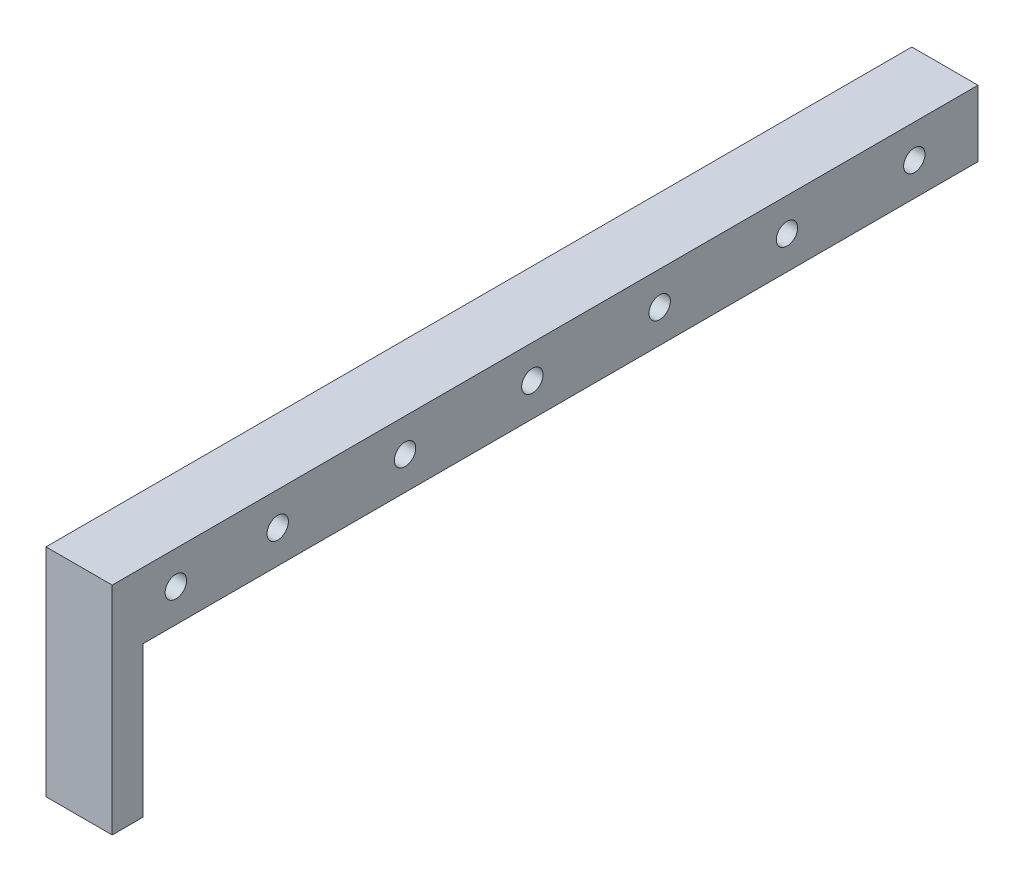
ISO-10303-21;
HEADER;
FILE_DESCRIPTION(('STEP AP214'),'2;1');
FILE_NAME('part.step','',(''),(''),'','','');
FILE_SCHEMA(('AUTOMOTIVE_DESIGN { 1 0 10303 214 1 1 1 1 }'));
ENDSEC;
DATA;
#1=APPLICATION_CONTEXT('core data for automotive mechanical design processes');
#2=APPLICATION_PROTOCOL_DEFINITION('international standard','automotive_design',2000,#1);
#3=PRODUCT_CONTEXT('',#1,'mechanical');
#4=PRODUCT('Part','Part','',(#3));
#5=PRODUCT_RELATED_PRODUCT_CATEGORY('part','',(#4));
#6=PRODUCT_DEFINITION_FORMATION('','',#4);
#7=PRODUCT_DEFINITION_CONTEXT('part definition',#1,'design');
#8=PRODUCT_DEFINITION('design','',#6,#7);
#9=PRODUCT_DEFINITION_SHAPE('','',#8);
#10=(LENGTH_UNIT() NAMED_UNIT(*) SI_UNIT(.MILLI.,.METRE.));
#11=(NAMED_UNIT(*) PLANE_ANGLE_UNIT() SI_UNIT($,.RADIAN.));
#12=(NAMED_UNIT(*) SI_UNIT($,.STERADIAN.) SOLID_ANGLE_UNIT());
#13=UNCERTAINTY_MEASURE_WITH_UNIT(LENGTH_MEASURE(1.E-05),#10,'distance_accuracy_value','');
#14=(GEOMETRIC_REPRESENTATION_CONTEXT(3) GLOBAL_UNCERTAINTY_ASSIGNED_CONTEXT((#13)) GLOBAL_UNIT_ASSIGNED_CONTEXT((#10,
#11,#12)) REPRESENTATION_CONTEXT('',''));
#15=CARTESIAN_POINT('',(0.,0.,0.));
#16=DIRECTION('',(0.,0.,1.));
#17=DIRECTION('',(1.,0.,0.));
#18=AXIS2_PLACEMENT_3D('',#15,#16,#17);
#19=CARTESIAN_POINT('',(-6.5,-6.5,85.));
#20=DIRECTION('',(0.,1.,0.));
#21=DIRECTION('',(0.,0.,1.));
#22=AXIS2_PLACEMENT_3D('',#19,#20,#21);
#23=PLANE('',#22);
#24=DIRECTION('',(1.,0.,0.));
#25=VECTOR('',#24,1.);
#26=CARTESIAN_POINT('',(-6.5,-6.5,79.));
#27=LINE('',#26,#25);
#28=CARTESIAN_POINT('',(-6.5,-6.5,79.));
#29=VERTEX_POINT('',#28);
#30=CARTESIAN_POINT('',(6.5,-6.50000000000001,79.));
#31=VERTEX_POINT('',#30);
#32=EDGE_CURVE('E53',#29,#31,#27,.T.);
#33=ORIENTED_EDGE('',*,*,#32,.F.);
#34=DIRECTION('',(0.,0.,-1.));
#35=VECTOR('',#34,1.);
#36=CARTESIAN_POINT('',(-6.5,-6.5,85.));
#37=LINE('',#36,#35);
#38=CARTESIAN_POINT('',(-6.5,-6.5,-85.));
#39=VERTEX_POINT('',#38);
#40=EDGE_CURVE('E11',#29,#39,#37,.T.);
#41=ORIENTED_EDGE('',*,*,#40,.T.);
#42=DIRECTION('',(1.,0.,0.));
#43=VECTOR('',#42,1.);
#44=CARTESIAN_POINT('',(-6.5,-6.5,-85.));
#45=LINE('',#44,#43);
#46=CARTESIAN_POINT('',(6.5,-6.5,-85.));
#47=VERTEX_POINT('',#46);
#48=EDGE_CURVE('E101',#39,#47,#45,.T.);
#49=ORIENTED_EDGE('',*,*,#48,.T.);
#50=DIRECTION('',(0.,0.,-1.));
#51=VECTOR('',#50,1.);
#52=CARTESIAN_POINT('',(6.5,-6.5,85.));
#53=LINE('',#52,#51);
#54=EDGE_CURVE('E46',#31,#47,#53,.T.);
#55=ORIENTED_EDGE('',*,*,#54,.F.);
#56=EDGE_LOOP('',(#33,#41,#49,#55));
#57=FACE_BOUND('',#56,.T.);
#58=ADVANCED_FACE('F37',(#57),#23,.F.);
#59=CARTESIAN_POINT('',(-6.5,6.5,85.));
#60=DIRECTION('',(1.,0.,0.));
#61=DIRECTION('',(0.,0.,-1.));
#62=AXIS2_PLACEMENT_3D('',#59,#60,#61);
#63=PLANE('',#62);
#64=CARTESIAN_POINT('',(-6.5,0.,-72.5));
#65=DIRECTION('',(1.,0.,0.));
#66=DIRECTION('',(0.,0.,-1.));
#67=AXIS2_PLACEMENT_3D('',#64,#65,#66);
#68=CIRCLE('',#67,5.25);
#69=CARTESIAN_POINT('',(-6.5,0.,-77.75));
#70=VERTEX_POINT('',#69);
#71=EDGE_CURVE('E41',#70,#70,#68,.T.);
#72=ORIENTED_EDGE('',*,*,#71,.T.);
#73=EDGE_LOOP('',(#72));
#74=FACE_BOUND('',#73,.T.);
#75=CARTESIAN_POINT('',(-6.5,0.,-47.5));
#76=DIRECTION('',(1.,0.,0.));
#77=DIRECTION('',(0.,0.,-1.));
#78=AXIS2_PLACEMENT_3D('',#75,#76,#77);
#79=CIRCLE('',#78,5.25);
#80=CARTESIAN_POINT('',(-6.5,0.,-52.75));
#81=VERTEX_POINT('',#80);
#82=EDGE_CURVE('E170',#81,#81,#79,.T.);
#83=ORIENTED_EDGE('',*,*,#82,.T.);
#84=EDGE_LOOP('',(#83));
#85=FACE_BOUND('',#84,.T.);
#86=CARTESIAN_POINT('',(-6.5,0.,-22.5));
#87=DIRECTION('',(1.,0.,0.));
#88=DIRECTION('',(0.,0.,-1.));
#89=AXIS2_PLACEMENT_3D('',#86,#87,#88);
#90=CIRCLE('',#89,5.25);
#91=CARTESIAN_POINT('',(-6.5,0.,-27.75));
#92=VERTEX_POINT('',#91);
#93=EDGE_CURVE('E168',#92,#92,#90,.T.);
#94=ORIENTED_EDGE('',*,*,#93,.T.);
#95=EDGE_LOOP('',(#94));
#96=FACE_BOUND('',#95,.T.);
#97=CARTESIAN_POINT('',(-6.5,0.,2.5));
#98=DIRECTION('',(1.,0.,0.));
#99=DIRECTION('',(0.,0.,-1.));
#100=AXIS2_PLACEMENT_3D('',#97,#98,#99);
#101=CIRCLE('',#100,5.25);
#102=CARTESIAN_POINT('',(-6.5,0.,-2.75));
#103=VERTEX_POINT('',#102);
#104=EDGE_CURVE('E165',#103,#103,#101,.T.);
#105=ORIENTED_EDGE('',*,*,#104,.T.);
#106=EDGE_LOOP('',(#105));
#107=FACE_BOUND('',#106,.T.);
#108=CARTESIAN_POINT('',(-6.5,0.,27.5));
#109=DIRECTION('',(1.,0.,0.));
#110=DIRECTION('',(0.,0.,-1.));
#111=AXIS2_PLACEMENT_3D('',#108,#109,#110);
#112=CIRCLE('',#111,5.25);
#113=CARTESIAN_POINT('',(-6.5,0.,22.25));
#114=VERTEX_POINT('',#113);
#115=EDGE_CURVE('E162',#114,#114,#112,.T.);
#116=ORIENTED_EDGE('',*,*,#115,.T.);
#117=EDGE_LOOP('',(#116));
#118=FACE_BOUND('',#117,.T.);
#119=CARTESIAN_POINT('',(-6.5,0.,52.5));
#120=DIRECTION('',(1.,0.,0.));
#121=DIRECTION('',(0.,0.,-1.));
#122=AXIS2_PLACEMENT_3D('',#119,#120,#121);
#123=CIRCLE('',#122,5.25);
#124=CARTESIAN_POINT('',(-6.5,0.,47.25));
#125=VERTEX_POINT('',#124);
#126=EDGE_CURVE('E159',#125,#125,#123,.T.);
#127=ORIENTED_EDGE('',*,*,#126,.T.);
#128=EDGE_LOOP('',(#127));
#129=FACE_BOUND('',#128,.T.);
#130=CARTESIAN_POINT('',(-6.5,0.,72.5));
#131=DIRECTION('',(1.,0.,0.));
#132=DIRECTION('',(0.,0.,-1.));
#133=AXIS2_PLACEMENT_3D('',#130,#131,#132);
#134=CIRCLE('',#133,5.25);
#135=CARTESIAN_POINT('',(-6.5,0.,67.25));
#136=VERTEX_POINT('',#135);
#137=EDGE_CURVE('E156',#136,#136,#134,.T.);
#138=ORIENTED_EDGE('',*,*,#137,.T.);
#139=EDGE_LOOP('',(#138));
#140=FACE_BOUND('',#139,.T.);
#141=DIRECTION('',(0.,0.,-1.));
#142=VECTOR('',#141,1.);
#143=CARTESIAN_POINT('',(-6.5,-36.,85.));
#144=LINE('',#143,#142);
#145=CARTESIAN_POINT('',(-6.5,-36.,85.));
#146=VERTEX_POINT('',#145);
#147=CARTESIAN_POINT('',(-6.5,-36.,79.));
#148=VERTEX_POINT('',#147);
#149=EDGE_CURVE('E104',#146,#148,#144,.T.);
#150=ORIENTED_EDGE('',*,*,#149,.F.);
#151=DIRECTION('',(0.,-1.,0.));
#152=VECTOR('',#151,1.);
#153=CARTESIAN_POINT('',(-6.5,6.5,85.));
#154=LINE('',#153,#152);
#155=CARTESIAN_POINT('',(-6.5,6.5,85.));
#156=VERTEX_POINT('',#155);
#157=EDGE_CURVE('E90',#156,#146,#154,.T.);
#158=ORIENTED_EDGE('',*,*,#157,.F.);
#159=DIRECTION('',(0.,0.,-1.));
#160=VECTOR('',#159,1.);
#161=CARTESIAN_POINT('',(-6.5,6.5,85.));
#162=LINE('',#161,#160);
#163=CARTESIAN_POINT('',(-6.5,6.5,-85.));
#164=VERTEX_POINT('',#163);
#165=EDGE_CURVE('E83',#156,#164,#162,.T.);
#166=ORIENTED_EDGE('',*,*,#165,.T.);
#167=DIRECTION('',(0.,-1.,0.));
#168=VECTOR('',#167,1.);
#169=CARTESIAN_POINT('',(-6.5,6.5,-85.));
#170=LINE('',#169,#168);
#171=EDGE_CURVE('E96',#164,#39,#170,.T.);
#172=ORIENTED_EDGE('',*,*,#171,.T.);
#173=ORIENTED_EDGE('',*,*,#40,.F.);
#174=DIRECTION('',(0.,-1.,0.));
#175=VECTOR('',#174,1.);
#176=CARTESIAN_POINT('',(-6.5,-5.5,79.));
#177=LINE('',#176,#175);
#178=EDGE_CURVE('E133',#29,#148,#177,.T.);
#179=ORIENTED_EDGE('',*,*,#178,.T.);
#180=EDGE_LOOP('',(#150,#158,#166,#172,#173,#179));
#181=FACE_BOUND('',#180,.T.);
#182=ADVANCED_FACE('F39',(#74,#85,#96,#107,#118,#129,#140,#181),#63,.F.);
#183=CARTESIAN_POINT('',(6.5,-6.5,85.));
#184=DIRECTION('',(-1.,0.,0.));
#185=DIRECTION('',(0.,0.,1.));
#186=AXIS2_PLACEMENT_3D('',#183,#184,#185);
#187=PLANE('',#186);
#188=CARTESIAN_POINT('',(6.5,0.,-72.5));
#189=DIRECTION('',(-1.,0.,0.));
#190=DIRECTION('',(0.,0.,1.));
#191=AXIS2_PLACEMENT_3D('',#188,#189,#190);
#192=CIRCLE('',#191,2.1);
#193=CARTESIAN_POINT('',(6.5,0.,-70.4));
#194=VERTEX_POINT('',#193);
#195=EDGE_CURVE('E130',#194,#194,#192,.T.);
#196=ORIENTED_EDGE('',*,*,#195,.T.);
#197=EDGE_LOOP('',(#196));
#198=FACE_BOUND('',#197,.T.);
#199=CARTESIAN_POINT('',(6.5,0.,-47.5));
#200=DIRECTION('',(-1.,0.,0.));
#201=DIRECTION('',(0.,0.,1.));
#202=AXIS2_PLACEMENT_3D('',#199,#200,#201);
#203=CIRCLE('',#202,2.1);
#204=CARTESIAN_POINT('',(6.5,0.,-45.4));
#205=VERTEX_POINT('',#204);
#206=EDGE_CURVE('E127',#205,#205,#203,.T.);
#207=ORIENTED_EDGE('',*,*,#206,.T.);
#208=EDGE_LOOP('',(#207));
#209=FACE_BOUND('',#208,.T.);
#210=CARTESIAN_POINT('',(6.5,0.,-22.5));
#211=DIRECTION('',(-1.,0.,0.));
#212=DIRECTION('',(0.,0.,1.));
#213=AXIS2_PLACEMENT_3D('',#210,#211,#212);
#214=CIRCLE('',#213,2.1);
#215=CARTESIAN_POINT('',(6.5,0.,-20.4));
#216=VERTEX_POINT('',#215);
#217=EDGE_CURVE('E124',#216,#216,#214,.T.);
#218=ORIENTED_EDGE('',*,*,#217,.T.);
#219=EDGE_LOOP('',(#218));
#220=FACE_BOUND('',#219,.T.);
#221=CARTESIAN_POINT('',(6.5,0.,2.5));
#222=DIRECTION('',(-1.,0.,0.));
#223=DIRECTION('',(0.,0.,1.));
#224=AXIS2_PLACEMENT_3D('',#221,#222,#223);
#225=CIRCLE('',#224,2.1);
#226=CARTESIAN_POINT('',(6.5,0.,4.6));
#227=VERTEX_POINT('',#226);
#228=EDGE_CURVE('E121',#227,#227,#225,.T.);
#229=ORIENTED_EDGE('',*,*,#228,.T.);
#230=EDGE_LOOP('',(#229));
#231=FACE_BOUND('',#230,.T.);
#232=CARTESIAN_POINT('',(6.5,0.,27.5));
#233=DIRECTION('',(-1.,0.,0.));
#234=DIRECTION('',(0.,0.,1.));
#235=AXIS2_PLACEMENT_3D('',#232,#233,#234);
#236=CIRCLE('',#235,2.1);
#237=CARTESIAN_POINT('',(6.5,0.,29.6));
#238=VERTEX_POINT('',#237);
#239=EDGE_CURVE('E118',#238,#238,#236,.T.);
#240=ORIENTED_EDGE('',*,*,#239,.T.);
#241=EDGE_LOOP('',(#240));
#242=FACE_BOUND('',#241,.T.);
#243=CARTESIAN_POINT('',(6.5,0.,52.5));
#244=DIRECTION('',(-1.,0.,0.));
#245=DIRECTION('',(0.,0.,1.));
#246=AXIS2_PLACEMENT_3D('',#243,#244,#245);
#247=CIRCLE('',#246,2.1);
#248=CARTESIAN_POINT('',(6.5,0.,54.6));
#249=VERTEX_POINT('',#248);
#250=EDGE_CURVE('E115',#249,#249,#247,.T.);
#251=ORIENTED_EDGE('',*,*,#250,.T.);
#252=EDGE_LOOP('',(#251));
#253=FACE_BOUND('',#252,.T.);
#254=CARTESIAN_POINT('',(6.5,0.,72.5));
#255=DIRECTION('',(-1.,0.,0.));
#256=DIRECTION('',(0.,0.,1.));
#257=AXIS2_PLACEMENT_3D('',#254,#255,#256);
#258=CIRCLE('',#257,2.1);
#259=CARTESIAN_POINT('',(6.5,0.,74.6));
#260=VERTEX_POINT('',#259);
#261=EDGE_CURVE('E112',#260,#260,#258,.T.);
#262=ORIENTED_EDGE('',*,*,#261,.T.);
#263=EDGE_LOOP('',(#262));
#264=FACE_BOUND('',#263,.T.);
#265=DIRECTION('',(0.,0.,-1.));
#266=VECTOR('',#265,1.);
#267=CARTESIAN_POINT('',(6.5,6.5,85.));
#268=LINE('',#267,#266);
#269=CARTESIAN_POINT('',(6.5,6.5,85.));
#270=VERTEX_POINT('',#269);
#271=CARTESIAN_POINT('',(6.5,6.5,-85.));
#272=VERTEX_POINT('',#271);
#273=EDGE_CURVE('E86',#270,#272,#268,.T.);
#274=ORIENTED_EDGE('',*,*,#273,.F.);
#275=DIRECTION('',(0.,1.,0.));
#276=VECTOR('',#275,1.);
#277=CARTESIAN_POINT('',(6.5,-6.5,85.));
#278=LINE('',#277,#276);
#279=CARTESIAN_POINT('',(6.5,-36.,85.));
#280=VERTEX_POINT('',#279);
#281=EDGE_CURVE('E328',#280,#270,#278,.T.);
#282=ORIENTED_EDGE('',*,*,#281,.F.);
#283=DIRECTION('',(0.,0.,-1.));
#284=VECTOR('',#283,1.);
#285=CARTESIAN_POINT('',(6.5,-36.,85.));
#286=LINE('',#285,#284);
#287=CARTESIAN_POINT('',(6.5,-36.,79.));
#288=VERTEX_POINT('',#287);
#289=EDGE_CURVE('E315',#280,#288,#286,.T.);
#290=ORIENTED_EDGE('',*,*,#289,.T.);
#291=DIRECTION('',(0.,1.,0.));
#292=VECTOR('',#291,1.);
#293=CARTESIAN_POINT('',(6.5,-36.,79.));
#294=LINE('',#293,#292);
#295=EDGE_CURVE('E316',#288,#31,#294,.T.);
#296=ORIENTED_EDGE('',*,*,#295,.T.);
#297=ORIENTED_EDGE('',*,*,#54,.T.);
#298=DIRECTION('',(0.,1.,0.));
#299=VECTOR('',#298,1.);
#300=CARTESIAN_POINT('',(6.5,-6.5,-85.));
#301=LINE('',#300,#299);
#302=EDGE_CURVE('E91',#47,#272,#301,.T.);
#303=ORIENTED_EDGE('',*,*,#302,.T.);
#304=EDGE_LOOP('',(#274,#282,#290,#296,#297,#303));
#305=FACE_BOUND('',#304,.T.);
#306=ADVANCED_FACE('F200',(#198,#209,#220,#231,#242,#253,#264,#305),#187,.F.);
#307=CARTESIAN_POINT('',(6.5,6.5,85.));
#308=DIRECTION('',(0.,-1.,0.));
#309=DIRECTION('',(0.,0.,-1.));
#310=AXIS2_PLACEMENT_3D('',#307,#308,#309);
#311=PLANE('',#310);
#312=DIRECTION('',(-1.,0.,0.));
#313=VECTOR('',#312,1.);
#314=CARTESIAN_POINT('',(6.5,6.5,-85.));
#315=LINE('',#314,#313);
#316=EDGE_CURVE('E80',#272,#164,#315,.T.);
#317=ORIENTED_EDGE('',*,*,#316,.T.);
#318=ORIENTED_EDGE('',*,*,#165,.F.);
#319=DIRECTION('',(-1.,0.,0.));
#320=VECTOR('',#319,1.);
#321=CARTESIAN_POINT('',(6.5,6.5,85.));
#322=LINE('',#321,#320);
#323=EDGE_CURVE('E62',#270,#156,#322,.T.);
#324=ORIENTED_EDGE('',*,*,#323,.F.);
#325=ORIENTED_EDGE('',*,*,#273,.T.);
#326=EDGE_LOOP('',(#317,#318,#324,#325));
#327=FACE_BOUND('',#326,.T.);
#328=ADVANCED_FACE('F82',(#327),#311,.F.);
#329=CARTESIAN_POINT('',(0.,0.,85.));
#330=DIRECTION('',(0.,0.,1.));
#331=DIRECTION('',(1.,0.,0.));
#332=AXIS2_PLACEMENT_3D('',#329,#330,#331);
#333=PLANE('',#332);
#334=ORIENTED_EDGE('',*,*,#281,.T.);
#335=ORIENTED_EDGE('',*,*,#323,.T.);
#336=ORIENTED_EDGE('',*,*,#157,.T.);
#337=DIRECTION('',(1.,0.,0.));
#338=VECTOR('',#337,1.);
#339=CARTESIAN_POINT('',(-6.5,-36.,85.));
#340=LINE('',#339,#338);
#341=EDGE_CURVE('E312',#146,#280,#340,.T.);
#342=ORIENTED_EDGE('',*,*,#341,.T.);
#343=EDGE_LOOP('',(#334,#335,#336,#342));
#344=FACE_BOUND('',#343,.T.);
#345=ADVANCED_FACE('F207',(#344),#333,.T.);
#346=CARTESIAN_POINT('',(0.,0.,-85.));
#347=DIRECTION('',(0.,0.,1.));
#348=DIRECTION('',(1.,0.,0.));
#349=AXIS2_PLACEMENT_3D('',#346,#347,#348);
#350=PLANE('',#349);
#351=ORIENTED_EDGE('',*,*,#171,.F.);
#352=ORIENTED_EDGE('',*,*,#316,.F.);
#353=ORIENTED_EDGE('',*,*,#302,.F.);
#354=ORIENTED_EDGE('',*,*,#48,.F.);
#355=EDGE_LOOP('',(#351,#352,#353,#354));
#356=FACE_BOUND('',#355,.T.);
#357=ADVANCED_FACE('F99',(#356),#350,.F.);
#358=CARTESIAN_POINT('',(0.,0.,79.));
#359=DIRECTION('',(0.,0.,1.));
#360=DIRECTION('',(1.,0.,0.));
#361=AXIS2_PLACEMENT_3D('',#358,#359,#360);
#362=PLANE('',#361);
#363=ORIENTED_EDGE('',*,*,#178,.F.);
#364=ORIENTED_EDGE('',*,*,#32,.T.);
#365=ORIENTED_EDGE('',*,*,#295,.F.);
#366=DIRECTION('',(1.,0.,0.));
#367=VECTOR('',#366,1.);
#368=CARTESIAN_POINT('',(-6.5,-36.,79.));
#369=LINE('',#368,#367);
#370=EDGE_CURVE('E319',#148,#288,#369,.T.);
#371=ORIENTED_EDGE('',*,*,#370,.F.);
#372=EDGE_LOOP('',(#363,#364,#365,#371));
#373=FACE_BOUND('',#372,.T.);
#374=ADVANCED_FACE('F210',(#373),#362,.F.);
#375=CARTESIAN_POINT('',(-6.5,-36.,85.));
#376=DIRECTION('',(0.,1.,0.));
#377=DIRECTION('',(0.,0.,1.));
#378=AXIS2_PLACEMENT_3D('',#375,#376,#377);
#379=PLANE('',#378);
#380=ORIENTED_EDGE('',*,*,#370,.T.);
#381=ORIENTED_EDGE('',*,*,#289,.F.);
#382=ORIENTED_EDGE('',*,*,#341,.F.);
#383=ORIENTED_EDGE('',*,*,#149,.T.);
#384=EDGE_LOOP('',(#380,#381,#382,#383));
#385=FACE_BOUND('',#384,.T.);
#386=ADVANCED_FACE('F213',(#385),#379,.F.);
#387=CARTESIAN_POINT('',(-11.5,0.,72.5));
#388=DIRECTION('',(1.,0.,0.));
#389=DIRECTION('',(0.,0.,-1.));
#390=AXIS2_PLACEMENT_3D('',#387,#388,#389);
#391=CYLINDRICAL_SURFACE('',#390,2.1);
#392=CARTESIAN_POINT('',(-2.,0.,72.5));
#393=DIRECTION('',(1.,0.,0.));
#394=DIRECTION('',(0.,0.,-1.));
#395=AXIS2_PLACEMENT_3D('',#392,#393,#394);
#396=CIRCLE('',#395,2.1);
#397=CARTESIAN_POINT('',(-2.,0.,70.4));
#398=VERTEX_POINT('',#397);
#399=EDGE_CURVE('E153',#398,#398,#396,.F.);
#400=ORIENTED_EDGE('',*,*,#399,.T.);
#401=EDGE_LOOP('',(#400));
#402=FACE_BOUND('',#401,.T.);
#403=ORIENTED_EDGE('',*,*,#261,.F.);
#404=EDGE_LOOP('',(#403));
#405=FACE_BOUND('',#404,.T.);
#406=ADVANCED_FACE('F216',(#402,#405),#391,.F.);
#407=CARTESIAN_POINT('',(-11.5,0.,52.5));
#408=DIRECTION('',(1.,0.,0.));
#409=DIRECTION('',(0.,0.,-1.));
#410=AXIS2_PLACEMENT_3D('',#407,#408,#409);
#411=CYLINDRICAL_SURFACE('',#410,2.1);
#412=CARTESIAN_POINT('',(-2.,0.,52.5));
#413=DIRECTION('',(1.,0.,0.));
#414=DIRECTION('',(0.,0.,-1.));
#415=AXIS2_PLACEMENT_3D('',#412,#413,#414);
#416=CIRCLE('',#415,2.1);
#417=CARTESIAN_POINT('',(-2.,0.,50.4));
#418=VERTEX_POINT('',#417);
#419=EDGE_CURVE('E150',#418,#418,#416,.F.);
#420=ORIENTED_EDGE('',*,*,#419,.T.);
#421=EDGE_LOOP('',(#420));
#422=FACE_BOUND('',#421,.T.);
#423=ORIENTED_EDGE('',*,*,#250,.F.);
#424=EDGE_LOOP('',(#423));
#425=FACE_BOUND('',#424,.T.);
#426=ADVANCED_FACE('F223',(#422,#425),#411,.F.);
#427=CARTESIAN_POINT('',(-11.5,0.,27.5));
#428=DIRECTION('',(1.,0.,0.));
#429=DIRECTION('',(0.,0.,-1.));
#430=AXIS2_PLACEMENT_3D('',#427,#428,#429);
#431=CYLINDRICAL_SURFACE('',#430,2.1);
#432=CARTESIAN_POINT('',(-2.,0.,27.5));
#433=DIRECTION('',(1.,0.,0.));
#434=DIRECTION('',(0.,0.,-1.));
#435=AXIS2_PLACEMENT_3D('',#432,#433,#434);
#436=CIRCLE('',#435,2.1);
#437=CARTESIAN_POINT('',(-2.,0.,25.4));
#438=VERTEX_POINT('',#437);
#439=EDGE_CURVE('E147',#438,#438,#436,.F.);
#440=ORIENTED_EDGE('',*,*,#439,.T.);
#441=EDGE_LOOP('',(#440));
#442=FACE_BOUND('',#441,.T.);
#443=ORIENTED_EDGE('',*,*,#239,.F.);
#444=EDGE_LOOP('',(#443));
#445=FACE_BOUND('',#444,.T.);
#446=ADVANCED_FACE('F227',(#442,#445),#431,.F.);
#447=CARTESIAN_POINT('',(-11.5,0.,2.5));
#448=DIRECTION('',(1.,0.,0.));
#449=DIRECTION('',(0.,0.,-1.));
#450=AXIS2_PLACEMENT_3D('',#447,#448,#449);
#451=CYLINDRICAL_SURFACE('',#450,2.1);
#452=CARTESIAN_POINT('',(-2.,0.,2.5));
#453=DIRECTION('',(1.,0.,0.));
#454=DIRECTION('',(0.,0.,-1.));
#455=AXIS2_PLACEMENT_3D('',#452,#453,#454);
#456=CIRCLE('',#455,2.1);
#457=CARTESIAN_POINT('',(-2.,0.,0.4));
#458=VERTEX_POINT('',#457);
#459=EDGE_CURVE('E144',#458,#458,#456,.F.);
#460=ORIENTED_EDGE('',*,*,#459,.T.);
#461=EDGE_LOOP('',(#460));
#462=FACE_BOUND('',#461,.T.);
#463=ORIENTED_EDGE('',*,*,#228,.F.);
#464=EDGE_LOOP('',(#463));
#465=FACE_BOUND('',#464,.T.);
#466=ADVANCED_FACE('F231',(#462,#465),#451,.F.);
#467=CARTESIAN_POINT('',(-11.5,0.,-22.5));
#468=DIRECTION('',(1.,0.,0.));
#469=DIRECTION('',(0.,0.,-1.));
#470=AXIS2_PLACEMENT_3D('',#467,#468,#469);
#471=CYLINDRICAL_SURFACE('',#470,2.1);
#472=CARTESIAN_POINT('',(-2.,0.,-22.5));
#473=DIRECTION('',(1.,0.,0.));
#474=DIRECTION('',(0.,0.,-1.));
#475=AXIS2_PLACEMENT_3D('',#472,#473,#474);
#476=CIRCLE('',#475,2.1);
#477=CARTESIAN_POINT('',(-2.,0.,-24.6));
#478=VERTEX_POINT('',#477);
#479=EDGE_CURVE('E141',#478,#478,#476,.F.);
#480=ORIENTED_EDGE('',*,*,#479,.T.);
#481=EDGE_LOOP('',(#480));
#482=FACE_BOUND('',#481,.T.);
#483=ORIENTED_EDGE('',*,*,#217,.F.);
#484=EDGE_LOOP('',(#483));
#485=FACE_BOUND('',#484,.T.);
#486=ADVANCED_FACE('F235',(#482,#485),#471,.F.);
#487=CARTESIAN_POINT('',(-11.5,0.,-47.5));
#488=DIRECTION('',(1.,0.,0.));
#489=DIRECTION('',(0.,0.,-1.));
#490=AXIS2_PLACEMENT_3D('',#487,#488,#489);
#491=CYLINDRICAL_SURFACE('',#490,2.1);
#492=CARTESIAN_POINT('',(-2.,0.,-47.5));
#493=DIRECTION('',(1.,0.,0.));
#494=DIRECTION('',(0.,0.,-1.));
#495=AXIS2_PLACEMENT_3D('',#492,#493,#494);
#496=CIRCLE('',#495,2.1);
#497=CARTESIAN_POINT('',(-2.,0.,-49.6));
#498=VERTEX_POINT('',#497);
#499=EDGE_CURVE('E137',#498,#498,#496,.F.);
#500=ORIENTED_EDGE('',*,*,#499,.T.);
#501=EDGE_LOOP('',(#500));
#502=FACE_BOUND('',#501,.T.);
#503=ORIENTED_EDGE('',*,*,#206,.F.);
#504=EDGE_LOOP('',(#503));
#505=FACE_BOUND('',#504,.T.);
#506=ADVANCED_FACE('F191',(#502,#505),#491,.F.);
#507=CARTESIAN_POINT('',(-11.5,0.,-72.5));
#508=DIRECTION('',(1.,0.,0.));
#509=DIRECTION('',(0.,0.,-1.));
#510=AXIS2_PLACEMENT_3D('',#507,#508,#509);
#511=CYLINDRICAL_SURFACE('',#510,2.1);
#512=CARTESIAN_POINT('',(-2.,0.,-72.5));
#513=DIRECTION('',(1.,0.,0.));
#514=DIRECTION('',(0.,0.,-1.));
#515=AXIS2_PLACEMENT_3D('',#512,#513,#514);
#516=CIRCLE('',#515,2.1);
#517=CARTESIAN_POINT('',(-2.,0.,-74.6));
#518=VERTEX_POINT('',#517);
#519=EDGE_CURVE('E134',#518,#518,#516,.F.);
#520=ORIENTED_EDGE('',*,*,#519,.T.);
#521=EDGE_LOOP('',(#520));
#522=FACE_BOUND('',#521,.T.);
#523=ORIENTED_EDGE('',*,*,#195,.F.);
#524=EDGE_LOOP('',(#523));
#525=FACE_BOUND('',#524,.T.);
#526=ADVANCED_FACE('F181',(#522,#525),#511,.F.);
#527=CARTESIAN_POINT('',(-11.,0.,-72.5));
#528=DIRECTION('',(1.,0.,0.));
#529=DIRECTION('',(0.,0.,-1.));
#530=AXIS2_PLACEMENT_3D('',#527,#528,#529);
#531=CYLINDRICAL_SURFACE('',#530,5.25);
#532=CARTESIAN_POINT('',(-2.,0.,-72.5));
#533=DIRECTION('',(1.,0.,0.));
#534=DIRECTION('',(0.,0.,-1.));
#535=AXIS2_PLACEMENT_3D('',#532,#533,#534);
#536=CIRCLE('',#535,5.25);
#537=CARTESIAN_POINT('',(-2.,0.,-77.75));
#538=VERTEX_POINT('',#537);
#539=EDGE_CURVE('E138',#538,#538,#536,.T.);
#540=ORIENTED_EDGE('',*,*,#539,.T.);
#541=EDGE_LOOP('',(#540));
#542=FACE_BOUND('',#541,.T.);
#543=ORIENTED_EDGE('',*,*,#71,.F.);
#544=EDGE_LOOP('',(#543));
#545=FACE_BOUND('',#544,.T.);
#546=ADVANCED_FACE('F178',(#542,#545),#531,.F.);
#547=CARTESIAN_POINT('',(-2.,0.,-72.5));
#548=DIRECTION('',(1.,0.,0.));
#549=DIRECTION('',(0.,0.,-1.));
#550=AXIS2_PLACEMENT_3D('',#547,#548,#549);
#551=PLANE('',#550);
#552=ORIENTED_EDGE('',*,*,#539,.F.);
#553=EDGE_LOOP('',(#552));
#554=FACE_BOUND('',#553,.T.);
#555=ORIENTED_EDGE('',*,*,#519,.F.);
#556=EDGE_LOOP('',(#555));
#557=FACE_BOUND('',#556,.T.);
#558=ADVANCED_FACE('F180',(#554,#557),#551,.F.);
#559=CARTESIAN_POINT('',(-11.,0.,-47.5));
#560=DIRECTION('',(1.,0.,0.));
#561=DIRECTION('',(0.,0.,-1.));
#562=AXIS2_PLACEMENT_3D('',#559,#560,#561);
#563=CYLINDRICAL_SURFACE('',#562,5.25);
#564=CARTESIAN_POINT('',(-2.,0.,-47.5));
#565=DIRECTION('',(1.,0.,0.));
#566=DIRECTION('',(0.,0.,-1.));
#567=AXIS2_PLACEMENT_3D('',#564,#565,#566);
#568=CIRCLE('',#567,5.25);
#569=CARTESIAN_POINT('',(-2.,0.,-52.75));
#570=VERTEX_POINT('',#569);
#571=EDGE_CURVE('E293',#570,#570,#568,.T.);
#572=ORIENTED_EDGE('',*,*,#571,.T.);
#573=EDGE_LOOP('',(#572));
#574=FACE_BOUND('',#573,.T.);
#575=ORIENTED_EDGE('',*,*,#82,.F.);
#576=EDGE_LOOP('',(#575));
#577=FACE_BOUND('',#576,.T.);
#578=ADVANCED_FACE('F188',(#574,#577),#563,.F.);
#579=CARTESIAN_POINT('',(-2.,0.,-47.5));
#580=DIRECTION('',(1.,0.,0.));
#581=DIRECTION('',(0.,0.,-1.));
#582=AXIS2_PLACEMENT_3D('',#579,#580,#581);
#583=PLANE('',#582);
#584=ORIENTED_EDGE('',*,*,#571,.F.);
#585=EDGE_LOOP('',(#584));
#586=FACE_BOUND('',#585,.T.);
#587=ORIENTED_EDGE('',*,*,#499,.F.);
#588=EDGE_LOOP('',(#587));
#589=FACE_BOUND('',#588,.T.);
#590=ADVANCED_FACE('F282',(#586,#589),#583,.F.);
#591=CARTESIAN_POINT('',(-11.,0.,-22.5));
#592=DIRECTION('',(1.,0.,0.));
#593=DIRECTION('',(0.,0.,-1.));
#594=AXIS2_PLACEMENT_3D('',#591,#592,#593);
#595=CYLINDRICAL_SURFACE('',#594,5.25);
#596=CARTESIAN_POINT('',(-2.,0.,-22.5));
#597=DIRECTION('',(1.,0.,0.));
#598=DIRECTION('',(0.,0.,-1.));
#599=AXIS2_PLACEMENT_3D('',#596,#597,#598);
#600=CIRCLE('',#599,5.25);
#601=CARTESIAN_POINT('',(-2.,0.,-27.75));
#602=VERTEX_POINT('',#601);
#603=EDGE_CURVE('E294',#602,#602,#600,.T.);
#604=ORIENTED_EDGE('',*,*,#603,.T.);
#605=EDGE_LOOP('',(#604));
#606=FACE_BOUND('',#605,.T.);
#607=ORIENTED_EDGE('',*,*,#93,.F.);
#608=EDGE_LOOP('',(#607));
#609=FACE_BOUND('',#608,.T.);
#610=ADVANCED_FACE('F278',(#606,#609),#595,.F.);
#611=CARTESIAN_POINT('',(-2.,0.,-22.5));
#612=DIRECTION('',(1.,0.,0.));
#613=DIRECTION('',(0.,0.,-1.));
#614=AXIS2_PLACEMENT_3D('',#611,#612,#613);
#615=PLANE('',#614);
#616=ORIENTED_EDGE('',*,*,#603,.F.);
#617=EDGE_LOOP('',(#616));
#618=FACE_BOUND('',#617,.T.);
#619=ORIENTED_EDGE('',*,*,#479,.F.);
#620=EDGE_LOOP('',(#619));
#621=FACE_BOUND('',#620,.T.);
#622=ADVANCED_FACE('F274',(#618,#621),#615,.F.);
#623=CARTESIAN_POINT('',(-11.,0.,2.5));
#624=DIRECTION('',(1.,0.,0.));
#625=DIRECTION('',(0.,0.,-1.));
#626=AXIS2_PLACEMENT_3D('',#623,#624,#625);
#627=CYLINDRICAL_SURFACE('',#626,5.25);
#628=CARTESIAN_POINT('',(-2.,0.,2.5));
#629=DIRECTION('',(1.,0.,0.));
#630=DIRECTION('',(0.,0.,-1.));
#631=AXIS2_PLACEMENT_3D('',#628,#629,#630);
#632=CIRCLE('',#631,5.25);
#633=CARTESIAN_POINT('',(-2.,0.,-2.75));
#634=VERTEX_POINT('',#633);
#635=EDGE_CURVE('E298',#634,#634,#632,.T.);
#636=ORIENTED_EDGE('',*,*,#635,.T.);
#637=EDGE_LOOP('',(#636));
#638=FACE_BOUND('',#637,.T.);
#639=ORIENTED_EDGE('',*,*,#104,.F.);
#640=EDGE_LOOP('',(#639));
#641=FACE_BOUND('',#640,.T.);
#642=ADVANCED_FACE('F270',(#638,#641),#627,.F.);
#643=CARTESIAN_POINT('',(-2.,0.,2.5));
#644=DIRECTION('',(1.,0.,0.));
#645=DIRECTION('',(0.,0.,-1.));
#646=AXIS2_PLACEMENT_3D('',#643,#644,#645);
#647=PLANE('',#646);
#648=ORIENTED_EDGE('',*,*,#635,.F.);
#649=EDGE_LOOP('',(#648));
#650=FACE_BOUND('',#649,.T.);
#651=ORIENTED_EDGE('',*,*,#459,.F.);
#652=EDGE_LOOP('',(#651));
#653=FACE_BOUND('',#652,.T.);
#654=ADVANCED_FACE('F266',(#650,#653),#647,.F.);
#655=CARTESIAN_POINT('',(-11.,0.,27.5));
#656=DIRECTION('',(1.,0.,0.));
#657=DIRECTION('',(0.,0.,-1.));
#658=AXIS2_PLACEMENT_3D('',#655,#656,#657);
#659=CYLINDRICAL_SURFACE('',#658,5.25);
#660=CARTESIAN_POINT('',(-2.,0.,27.5));
#661=DIRECTION('',(1.,0.,0.));
#662=DIRECTION('',(0.,0.,-1.));
#663=AXIS2_PLACEMENT_3D('',#660,#661,#662);
#664=CIRCLE('',#663,5.25);
#665=CARTESIAN_POINT('',(-2.,0.,22.25));
#666=VERTEX_POINT('',#665);
#667=EDGE_CURVE('E303',#666,#666,#664,.T.);
#668=ORIENTED_EDGE('',*,*,#667,.T.);
#669=EDGE_LOOP('',(#668));
#670=FACE_BOUND('',#669,.T.);
#671=ORIENTED_EDGE('',*,*,#115,.F.);
#672=EDGE_LOOP('',(#671));
#673=FACE_BOUND('',#672,.T.);
#674=ADVANCED_FACE('F262',(#670,#673),#659,.F.);
#675=CARTESIAN_POINT('',(-2.,0.,27.5));
#676=DIRECTION('',(1.,0.,0.));
#677=DIRECTION('',(0.,0.,-1.));
#678=AXIS2_PLACEMENT_3D('',#675,#676,#677);
#679=PLANE('',#678);
#680=ORIENTED_EDGE('',*,*,#667,.F.);
#681=EDGE_LOOP('',(#680));
#682=FACE_BOUND('',#681,.T.);
#683=ORIENTED_EDGE('',*,*,#439,.F.);
#684=EDGE_LOOP('',(#683));
#685=FACE_BOUND('',#684,.T.);
#686=ADVANCED_FACE('F258',(#682,#685),#679,.F.);
#687=CARTESIAN_POINT('',(-11.,0.,52.5));
#688=DIRECTION('',(1.,0.,0.));
#689=DIRECTION('',(0.,0.,-1.));
#690=AXIS2_PLACEMENT_3D('',#687,#688,#689);
#691=CYLINDRICAL_SURFACE('',#690,5.25);
#692=CARTESIAN_POINT('',(-2.,0.,52.5));
#693=DIRECTION('',(1.,0.,0.));
#694=DIRECTION('',(0.,0.,-1.));
#695=AXIS2_PLACEMENT_3D('',#692,#693,#694);
#696=CIRCLE('',#695,5.25);
#697=CARTESIAN_POINT('',(-2.,0.,47.25));
#698=VERTEX_POINT('',#697);
#699=EDGE_CURVE('E306',#698,#698,#696,.T.);
#700=ORIENTED_EDGE('',*,*,#699,.T.);
#701=EDGE_LOOP('',(#700));
#702=FACE_BOUND('',#701,.T.);
#703=ORIENTED_EDGE('',*,*,#126,.F.);
#704=EDGE_LOOP('',(#703));
#705=FACE_BOUND('',#704,.T.);
#706=ADVANCED_FACE('F254',(#702,#705),#691,.F.);
#707=CARTESIAN_POINT('',(-2.,0.,52.5));
#708=DIRECTION('',(1.,0.,0.));
#709=DIRECTION('',(0.,0.,-1.));
#710=AXIS2_PLACEMENT_3D('',#707,#708,#709);
#711=PLANE('',#710);
#712=ORIENTED_EDGE('',*,*,#699,.F.);
#713=EDGE_LOOP('',(#712));
#714=FACE_BOUND('',#713,.T.);
#715=ORIENTED_EDGE('',*,*,#419,.F.);
#716=EDGE_LOOP('',(#715));
#717=FACE_BOUND('',#716,.T.);
#718=ADVANCED_FACE('F250',(#714,#717),#711,.F.);
#719=CARTESIAN_POINT('',(-11.,0.,72.5));
#720=DIRECTION('',(1.,0.,0.));
#721=DIRECTION('',(0.,0.,-1.));
#722=AXIS2_PLACEMENT_3D('',#719,#720,#721);
#723=CYLINDRICAL_SURFACE('',#722,5.25);
#724=CARTESIAN_POINT('',(-2.,0.,72.5));
#725=DIRECTION('',(1.,0.,0.));
#726=DIRECTION('',(0.,0.,-1.));
#727=AXIS2_PLACEMENT_3D('',#724,#725,#726);
#728=CIRCLE('',#727,5.25);
#729=CARTESIAN_POINT('',(-2.,0.,67.25));
#730=VERTEX_POINT('',#729);
#731=EDGE_CURVE('E309',#730,#730,#728,.T.);
#732=ORIENTED_EDGE('',*,*,#731,.T.);
#733=EDGE_LOOP('',(#732));
#734=FACE_BOUND('',#733,.T.);
#735=ORIENTED_EDGE('',*,*,#137,.F.);
#736=EDGE_LOOP('',(#735));
#737=FACE_BOUND('',#736,.T.);
#738=ADVANCED_FACE('F246',(#734,#737),#723,.F.);
#739=CARTESIAN_POINT('',(-2.,0.,72.5));
#740=DIRECTION('',(1.,0.,0.));
#741=DIRECTION('',(0.,0.,-1.));
#742=AXIS2_PLACEMENT_3D('',#739,#740,#741);
#743=PLANE('',#742);
#744=ORIENTED_EDGE('',*,*,#731,.F.);
#745=EDGE_LOOP('',(#744));
#746=FACE_BOUND('',#745,.T.);
#747=ORIENTED_EDGE('',*,*,#399,.F.);
#748=EDGE_LOOP('',(#747));
#749=FACE_BOUND('',#748,.T.);
#750=ADVANCED_FACE('F243',(#746,#749),#743,.F.);
#751=CLOSED_SHELL('',(#58,#182,#306,#328,#345,#357,#374,#386,#406,#426,#446,#466,#486,#506,#526,
#546,#558,#578,#590,#610,#622,#642,#654,#674,#686,#706,#718,#738,#750));
#752=MANIFOLD_SOLID_BREP('B2',#751);
#753=ADVANCED_BREP_SHAPE_REPRESENTATION('',(#18,#752),#14);
#754=SHAPE_DEFINITION_REPRESENTATION(#9,#753);
ENDSEC;
END-ISO-10303-21;
